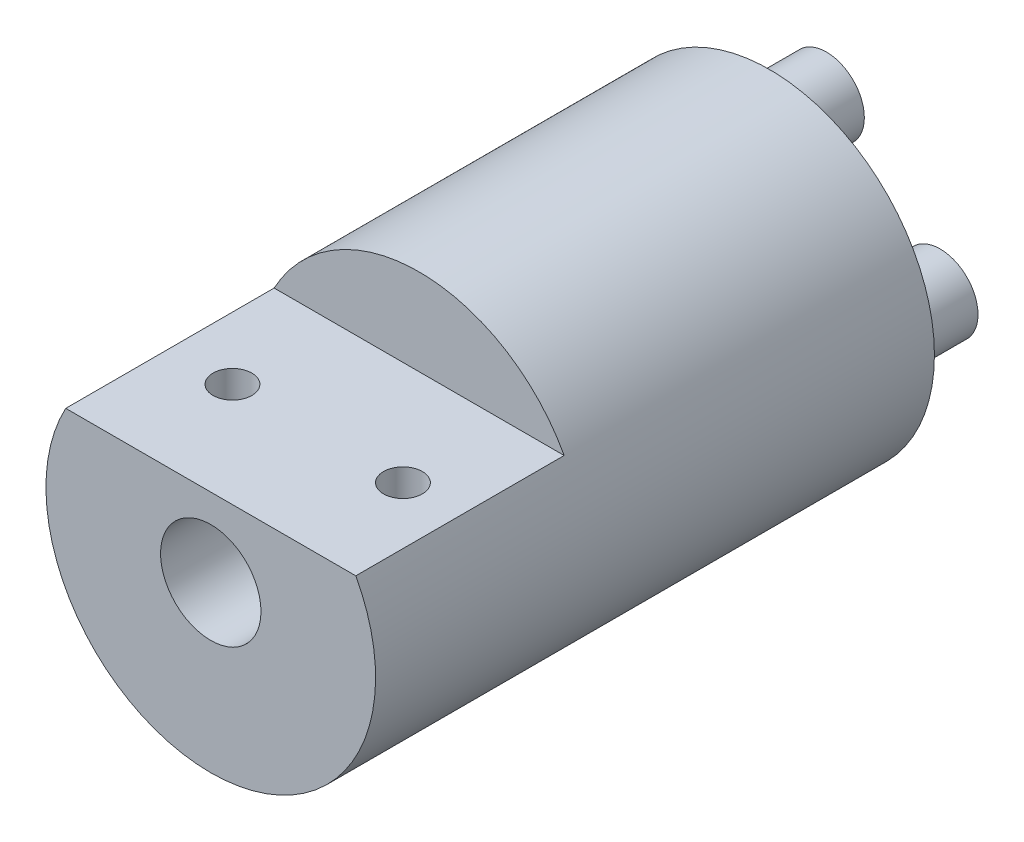
ISO-10303-21;
HEADER;
FILE_DESCRIPTION(('STEP AP214'),'2;1');
FILE_NAME('part.step','',(''),(''),'','','');
FILE_SCHEMA(('AUTOMOTIVE_DESIGN { 1 0 10303 214 1 1 1 1 }'));
ENDSEC;
DATA;
#1=APPLICATION_CONTEXT('core data for automotive mechanical design processes');
#2=APPLICATION_PROTOCOL_DEFINITION('international standard','automotive_design',2000,#1);
#3=PRODUCT_CONTEXT('',#1,'mechanical');
#4=PRODUCT('Part','Part','',(#3));
#5=PRODUCT_RELATED_PRODUCT_CATEGORY('part','',(#4));
#6=PRODUCT_DEFINITION_FORMATION('','',#4);
#7=PRODUCT_DEFINITION_CONTEXT('part definition',#1,'design');
#8=PRODUCT_DEFINITION('design','',#6,#7);
#9=PRODUCT_DEFINITION_SHAPE('','',#8);
#10=(LENGTH_UNIT() NAMED_UNIT(*) SI_UNIT(.MILLI.,.METRE.));
#11=(NAMED_UNIT(*) PLANE_ANGLE_UNIT() SI_UNIT($,.RADIAN.));
#12=(NAMED_UNIT(*) SI_UNIT($,.STERADIAN.) SOLID_ANGLE_UNIT());
#13=UNCERTAINTY_MEASURE_WITH_UNIT(LENGTH_MEASURE(1.E-05),#10,'distance_accuracy_value','');
#14=(GEOMETRIC_REPRESENTATION_CONTEXT(3) GLOBAL_UNCERTAINTY_ASSIGNED_CONTEXT((#13)) GLOBAL_UNIT_ASSIGNED_CONTEXT((#10,
#11,#12)) REPRESENTATION_CONTEXT('',''));
#15=CARTESIAN_POINT('',(0.,0.,0.));
#16=DIRECTION('',(0.,0.,1.));
#17=DIRECTION('',(1.,0.,0.));
#18=AXIS2_PLACEMENT_3D('',#15,#16,#17);
#19=CARTESIAN_POINT('',(0.,0.,29.5));
#20=DIRECTION('',(0.,0.,-1.));
#21=DIRECTION('',(-1.,0.,0.));
#22=AXIS2_PLACEMENT_3D('',#19,#20,#21);
#23=CYLINDRICAL_SURFACE('',#22,1.75);
#24=CARTESIAN_POINT('',(0.,0.,8.3));
#25=DIRECTION('',(0.,0.,1.));
#26=DIRECTION('',(1.,0.,0.));
#27=AXIS2_PLACEMENT_3D('',#24,#25,#26);
#28=CIRCLE('',#27,1.75);
#29=CARTESIAN_POINT('',(1.75,0.,8.3));
#30=VERTEX_POINT('',#29);
#31=EDGE_CURVE('E94',#30,#30,#28,.T.);
#32=ORIENTED_EDGE('',*,*,#31,.T.);
#33=EDGE_LOOP('',(#32));
#34=FACE_BOUND('',#33,.T.);
#35=CARTESIAN_POINT('',(0.,0.,0.));
#36=DIRECTION('',(0.,0.,-1.));
#37=DIRECTION('',(-1.,0.,0.));
#38=AXIS2_PLACEMENT_3D('',#35,#36,#37);
#39=CIRCLE('',#38,1.75);
#40=CARTESIAN_POINT('',(-1.75,0.,0.));
#41=VERTEX_POINT('',#40);
#42=EDGE_CURVE('E83',#41,#41,#39,.T.);
#43=ORIENTED_EDGE('',*,*,#42,.T.);
#44=EDGE_LOOP('',(#43));
#45=FACE_BOUND('',#44,.T.);
#46=ADVANCED_FACE('F33',(#34,#45),#23,.F.);
#47=CARTESIAN_POINT('',(0.,0.,29.5));
#48=DIRECTION('',(0.,0.,-1.));
#49=DIRECTION('',(-1.,0.,0.));
#50=AXIS2_PLACEMENT_3D('',#47,#48,#49);
#51=CYLINDRICAL_SURFACE('',#50,8.7);
#52=CARTESIAN_POINT('',(4.64445354346428,-7.35656518237976,25.025));
#53=CARTESIAN_POINT('',(4.71815393182572,-7.31003303115343,25.0249987797796));
#54=CARTESIAN_POINT('',(4.79120086093062,-7.26235113807829,25.0170490581823));
#55=CARTESIAN_POINT('',(4.93371045265028,-7.16630437975942,24.9860486364902));
#56=CARTESIAN_POINT('',(5.00316524240529,-7.11793828760546,24.9629661673902));
#57=CARTESIAN_POINT('',(5.13234537040392,-7.02530915044312,24.9040585753655));
#58=CARTESIAN_POINT('',(5.19240427455238,-6.98097384244621,24.8690792961992));
#59=CARTESIAN_POINT('',(5.30553479046785,-6.8953828658052,24.7864392723338));
#60=CARTESIAN_POINT('',(5.35862076745976,-6.8541209440096,24.7388052306372));
#61=CARTESIAN_POINT('',(5.44111107783713,-6.78868339315813,24.6469672172265));
#62=CARTESIAN_POINT('',(5.47287870889878,-6.76306095657114,24.6059063340448));
#63=CARTESIAN_POINT('',(5.53062049286008,-6.71592288239306,24.5177813027306));
#64=CARTESIAN_POINT('',(5.55660300930146,-6.6944013227447,24.4707259776544));
#65=CARTESIAN_POINT('',(5.59755819733306,-6.6601750756637,24.3798119717248));
#66=CARTESIAN_POINT('',(5.61365573407519,-6.64659069016058,24.3367945421334));
#67=CARTESIAN_POINT('',(5.64011710526801,-6.6241514473601,24.2478443046384));
#68=CARTESIAN_POINT('',(5.65048466506954,-6.61529351728231,24.2019134126338));
#69=CARTESIAN_POINT('',(5.66484680246569,-6.60299963344695,24.1080934713376));
#70=CARTESIAN_POINT('',(5.66880906823867,-6.59959117073903,24.0601957361293));
#71=CARTESIAN_POINT('',(5.66995213655247,-6.59860924979251,23.964260262807));
#72=CARTESIAN_POINT('',(5.6671339358747,-6.60103493388885,23.9162225463082));
#73=CARTESIAN_POINT('',(5.65544788493367,-6.61104825335389,23.825549208808));
#74=CARTESIAN_POINT('',(5.64709802675579,-6.61819376158997,23.782794761153));
#75=CARTESIAN_POINT('',(5.62537349968405,-6.63666895692325,23.6995450077957));
#76=CARTESIAN_POINT('',(5.61199797159353,-6.64799935947114,23.6590500897466));
#77=CARTESIAN_POINT('',(5.57970995690913,-6.67512622823768,23.5781533636793));
#78=CARTESIAN_POINT('',(5.56046348613067,-6.69118917236125,23.5379759391255));
#79=CARTESIAN_POINT('',(5.51769770025128,-6.72649858416267,23.4614893172049));
#80=CARTESIAN_POINT('',(5.49417498254176,-6.74574758588595,23.4251832370286));
#81=CARTESIAN_POINT('',(5.43142231018471,-6.79646631793209,23.3402478467985));
#82=CARTESIAN_POINT('',(5.39006378889856,-6.82937497625125,23.2940396390201));
#83=CARTESIAN_POINT('',(5.30131985403172,-6.89849142146871,23.2107815956532));
#84=CARTESIAN_POINT('',(5.25392507938524,-6.93470430731019,23.1737462538533));
#85=CARTESIAN_POINT('',(5.15383921261313,-7.00941427412087,23.1085054924574));
#86=CARTESIAN_POINT('',(5.10108760394258,-7.04793482185946,23.0804203365803));
#87=CARTESIAN_POINT('',(4.99198174042232,-7.12563040394744,23.0338906477511));
#88=CARTESIAN_POINT('',(4.93562791407123,-7.16480536004426,23.0154449705296));
#89=CARTESIAN_POINT('',(4.81169244339806,-7.24872478284551,22.9864469916565));
#90=CARTESIAN_POINT('',(4.74369588773675,-7.29342182496607,22.9774967927111));
#91=CARTESIAN_POINT('',(4.60610927787613,-7.38108475497537,22.973407937583));
#92=CARTESIAN_POINT('',(4.53651852060671,-7.42404985506514,22.9782754962882));
#93=CARTESIAN_POINT('',(4.3992385203194,-7.50619623345103,23.0023714705854));
#94=CARTESIAN_POINT('',(4.33153746812218,-7.54543120611925,23.0213430080897));
#95=CARTESIAN_POINT('',(4.19953977195899,-7.61968406373472,23.0738751274582));
#96=CARTESIAN_POINT('',(4.13523984654595,-7.65470605658775,23.1074213484731));
#97=CARTESIAN_POINT('',(4.0208662634321,-7.7153297110385,23.1839704994075));
#98=CARTESIAN_POINT('',(3.9700149693819,-7.74155991283555,23.2253094981075));
#99=CARTESIAN_POINT('',(3.87608187882106,-7.78901522999145,23.3183942939057));
#100=CARTESIAN_POINT('',(3.83299160455978,-7.8102458145767,23.3701286033301));
#101=CARTESIAN_POINT('',(3.76237881265611,-7.84447803418724,23.4746574568165));
#102=CARTESIAN_POINT('',(3.73352796025877,-7.85821133312875,23.5263179684659));
#103=CARTESIAN_POINT('',(3.68492834834605,-7.8811185766332,23.6346862651745));
#104=CARTESIAN_POINT('',(3.66517350201494,-7.8902955704824,23.6913906445996));
#105=CARTESIAN_POINT('',(3.63720273064806,-7.90322536669725,23.8024214713945));
#106=CARTESIAN_POINT('',(3.62807689304229,-7.9074068642865,23.8564706078811));
#107=CARTESIAN_POINT('',(3.61857630760304,-7.91175927682302,23.9654870774391));
#108=CARTESIAN_POINT('',(3.61819886176706,-7.91193142825204,24.0204541221945));
#109=CARTESIAN_POINT('',(3.62604964841011,-7.90833607113019,24.1274504989465));
#110=CARTESIAN_POINT('',(3.63394005588869,-7.90472321909037,24.179510353952));
#111=CARTESIAN_POINT('',(3.65746436780409,-7.89386600709286,24.2814485491898));
#112=CARTESIAN_POINT('',(3.67309800411338,-7.88662177288022,24.3313269648946));
#113=CARTESIAN_POINT('',(3.71161701593956,-7.86856734215734,24.427983748086));
#114=CARTESIAN_POINT('',(3.73456039829486,-7.8577285920322,24.4747335686749));
#115=CARTESIAN_POINT('',(3.78674726657341,-7.83271216068327,24.5635786597096));
#116=CARTESIAN_POINT('',(3.81599163147017,-7.81853401359505,24.6056732795238));
#117=CARTESIAN_POINT('',(3.88134641498917,-7.786304655176,24.6863850122854));
#118=CARTESIAN_POINT('',(3.91773086215512,-7.7680928421786,24.7247154355401));
#119=CARTESIAN_POINT('',(3.99499359395253,-7.72864202947403,24.794699375893));
#120=CARTESIAN_POINT('',(4.03587379790424,-7.70740173569705,24.8263500243103));
#121=CARTESIAN_POINT('',(4.12474776900221,-7.66023549888671,24.8852262756241));
#122=CARTESIAN_POINT('',(4.17305021149036,-7.63405874433185,24.9117832277125));
#123=CARTESIAN_POINT('',(4.271991043954,-7.57913546971955,24.9564754425296));
#124=CARTESIAN_POINT('',(4.32262929865055,-7.55038909839168,24.974611192302));
#125=CARTESIAN_POINT('',(4.41856092830397,-7.49459834866594,25.0008760721198));
#126=CARTESIAN_POINT('',(4.46373187065483,-7.46778987313824,25.0099721491783));
#127=CARTESIAN_POINT('',(4.55416765393656,-7.41298591876853,25.0220354547143));
#128=CARTESIAN_POINT('',(4.59943252003069,-7.38499006747672,25.0250007453905));
#129=CARTESIAN_POINT('',(4.64445354346428,-7.35656518237976,25.025));
#130=B_SPLINE_CURVE_WITH_KNOTS('',3,(#52,#53,#54,#55,#56,#57,#58,#59,#60,#61,#62,#63,#64,#65,
#66,#67,#68,#69,#70,#71,#72,#73,#74,#75,#76,#77,#78,#79,#80,#81,#82,#83,#84,#85,#86,#87,#88,#89,
#90,#91,#92,#93,#94,#95,#96,#97,#98,#99,#100,#101,#102,#103,#104,#105,#106,#107,#108,#109,#110,
#111,#112,#113,#114,#115,#116,#117,#118,#119,#120,#121,#122,#123,#124,#125,#126,#127,#128,#129),
.UNSPECIFIED.,.T.,.F.,(4,2,2,2,2,2,2,2,2,2,2,2,2,2,2,2,2,2,2,2,2,2,2,2,2,2,2,2,2,2,2,2,2,2,2,2,
2,2,4),(0.,0.261263380499854,0.523077009480396,0.76921241420961,1.0148325143346,
1.18789912579184,1.36071388635489,1.5038179571006,1.64682887879994,1.79055899999154,
1.93426799302658,2.06612728963617,2.19800913938953,2.33955757349703,2.48121913459888,
2.69069762179205,2.90050501825504,3.11302310372105,3.32551595616199,3.56993128448405,
3.81445656223008,4.05463412537287,4.29457556955478,4.50509593859626,4.71538493225158,
4.89661990149859,5.0777334160285,5.24182670869693,5.40586939434878,5.56346128494191,
5.7210477189264,5.87991721186796,6.03880888112733,6.20580093240574,6.37286455442908,
6.55519441095419,6.73751372104104,6.89706008126183,7.05665686273518),.UNSPECIFIED.);
#131=CARTESIAN_POINT('',(4.64445354346428,-7.35656518237976,25.025));
#132=VERTEX_POINT('',#131);
#133=EDGE_CURVE('E105',#132,#132,#130,.T.);
#134=ORIENTED_EDGE('',*,*,#133,.T.);
#135=EDGE_LOOP('',(#134));
#136=FACE_BOUND('',#135,.T.);
#137=CARTESIAN_POINT('',(-4.35554645653572,-7.53121604158048,25.025));
#138=CARTESIAN_POINT('',(-4.29400428038766,-7.56680795887507,25.0249993342608));
#139=CARTESIAN_POINT('',(-4.23201650551024,-7.60164240081337,25.0194560856518));
#140=CARTESIAN_POINT('',(-4.10882775341196,-7.6689278914294,24.9968315762793));
#141=CARTESIAN_POINT('',(-4.04762661929849,-7.70137942165169,24.9797526538265));
#142=CARTESIAN_POINT('',(-3.92772718640544,-7.76321665446499,24.9336704729739));
#143=CARTESIAN_POINT('',(-3.86904373645899,-7.79258534309199,24.9046050000717));
#144=CARTESIAN_POINT('',(-3.7569935006844,-7.84722143526912,24.83469203926));
#145=CARTESIAN_POINT('',(-3.70362372425557,-7.87249115086863,24.7938512296611));
#146=CARTESIAN_POINT('',(-3.60994323413651,-7.91585159217477,24.7059715796399));
#147=CARTESIAN_POINT('',(-3.56885512382942,-7.93441225926918,24.6599941045405));
#148=CARTESIAN_POINT('',(-3.49506956632667,-7.96719042664165,24.5603897927461));
#149=CARTESIAN_POINT('',(-3.46236609477792,-7.98141104664498,24.5067684914785));
#150=CARTESIAN_POINT('',(-3.40986146633821,-8.00397279938928,24.3993850881871));
#151=CARTESIAN_POINT('',(-3.38908617804231,-8.01276489614381,24.3461922839183));
#152=CARTESIAN_POINT('',(-3.35660164369548,-8.02642759664717,24.2366308713724));
#153=CARTESIAN_POINT('',(-3.34488872806173,-8.0312997876964,24.1802635584631));
#154=CARTESIAN_POINT('',(-3.33147312958303,-8.03687349496063,24.0694971388724));
#155=CARTESIAN_POINT('',(-3.32922754748633,-8.03780123206871,24.0151744006049));
#156=CARTESIAN_POINT('',(-3.33334630447946,-8.03609405425717,23.9069175977051));
#157=CARTESIAN_POINT('',(-3.33970930018121,-8.03345969521075,23.8529834737488));
#158=CARTESIAN_POINT('',(-3.36060616695197,-8.02473985388008,23.7479240845968));
#159=CARTESIAN_POINT('',(-3.37500763794755,-8.01871027964305,23.6967676799947));
#160=CARTESIAN_POINT('',(-3.41130942560675,-8.00333393197255,23.5977268776783));
#161=CARTESIAN_POINT('',(-3.43320999119779,-7.99398704842284,23.5498425886429));
#162=CARTESIAN_POINT('',(-3.48420000972969,-7.97189654934941,23.457583596));
#163=CARTESIAN_POINT('',(-3.51342881708616,-7.95908666071719,23.4133019963576));
#164=CARTESIAN_POINT('',(-3.57774771732605,-7.9303820327362,23.3303656722392));
#165=CARTESIAN_POINT('',(-3.61283891929251,-7.91448670957408,23.2917120150856));
#166=CARTESIAN_POINT('',(-3.68980769941173,-7.87890929137596,23.218728517958));
#167=CARTESIAN_POINT('',(-3.73195598439553,-7.85906448145331,23.1847642072846));
#168=CARTESIAN_POINT('',(-3.82006727091189,-7.81661555971276,23.1243610100446));
#169=CARTESIAN_POINT('',(-3.86603153392832,-7.79401053425238,23.0979246249525));
#170=CARTESIAN_POINT('',(-3.96470537082819,-7.74431566728342,23.0507257769388));
#171=CARTESIAN_POINT('',(-4.01764975983226,-7.71700530604508,23.0306877760172));
#172=CARTESIAN_POINT('',(-4.12498112225461,-7.66017136341189,22.9997054299539));
#173=CARTESIAN_POINT('',(-4.17936873151814,-7.63064679567203,22.9887651640561));
#174=CARTESIAN_POINT('',(-4.29436652076137,-7.56658511231489,22.9750132012102));
#175=CARTESIAN_POINT('',(-4.35499456004738,-7.53185610041308,22.9732434884127));
#176=CARTESIAN_POINT('',(-4.47494238072689,-7.46121608743635,22.9802042642983));
#177=CARTESIAN_POINT('',(-4.53426158579556,-7.42530458235648,22.9889392881853));
#178=CARTESIAN_POINT('',(-4.65599897262735,-7.3496456365721,23.0178391236633));
#179=CARTESIAN_POINT('',(-4.71815426172329,-7.30986600234234,23.0390366098801));
#180=CARTESIAN_POINT('',(-4.83786001754329,-7.23119967774362,23.0931818470149));
#181=CARTESIAN_POINT('',(-4.89540544158341,-7.19231399752878,23.1261422560299));
#182=CARTESIAN_POINT('',(-5.00511863645392,-7.11641146058272,23.2042005895051));
#183=CARTESIAN_POINT('',(-5.05717446419203,-7.07943930915505,23.2495011396175));
#184=CARTESIAN_POINT('',(-5.15246031512338,-7.01039240441176,23.3516163088381));
#185=CARTESIAN_POINT('',(-5.19571327596723,-6.97830497946207,23.408400214617));
#186=CARTESIAN_POINT('',(-5.25795574761008,-6.93144127943437,23.5115427852014));
#187=CARTESIAN_POINT('',(-5.28020770185791,-6.91447717479443,23.5549536908275));
#188=CARTESIAN_POINT('',(-5.31865564537531,-6.88494657213648,23.6457823977906));
#189=CARTESIAN_POINT('',(-5.33485728937619,-6.8723759685794,23.6931964066693));
#190=CARTESIAN_POINT('',(-5.36036024273163,-6.85250370417936,23.7912945387505));
#191=CARTESIAN_POINT('',(-5.36961398432916,-6.84523837420239,23.8419986680691));
#192=CARTESIAN_POINT('',(-5.3803541816674,-6.83680037833963,23.9447228569133));
#193=CARTESIAN_POINT('',(-5.38184460734218,-6.8356245984367,23.9967422301827));
#194=CARTESIAN_POINT('',(-5.37722204400399,-6.83926063199996,24.0945473199208));
#195=CARTESIAN_POINT('',(-5.37191421013725,-6.84343842036687,24.1403985737858));
#196=CARTESIAN_POINT('',(-5.35537655575865,-6.85638759426895,24.2303388244335));
#197=CARTESIAN_POINT('',(-5.3441460281097,-6.86515952831901,24.274427610111));
#198=CARTESIAN_POINT('',(-5.3161342998375,-6.88687389623165,24.3605283081061));
#199=CARTESIAN_POINT('',(-5.29926596350768,-6.89988171157331,24.4024948947835));
#200=CARTESIAN_POINT('',(-5.26076928127915,-6.92927790238886,24.482893300237));
#201=CARTESIAN_POINT('',(-5.23913910745361,-6.94566757590489,24.5213237535424));
#202=CARTESIAN_POINT('',(-5.18820738652277,-6.98381427326492,24.5998443715484));
#203=CARTESIAN_POINT('',(-5.15823826555677,-7.00600890058962,24.639286978872));
#204=CARTESIAN_POINT('',(-5.09388012285587,-7.05294086651045,24.7126525496323));
#205=CARTESIAN_POINT('',(-5.05948828812009,-7.07767982136524,24.7465719687401));
#206=CARTESIAN_POINT('',(-4.97975484263506,-7.13406444014185,24.8150328176498));
#207=CARTESIAN_POINT('',(-4.93360454744194,-7.16609597262649,24.8483165306307));
#208=CARTESIAN_POINT('',(-4.83718646398712,-7.23153032563,24.9065452719105));
#209=CARTESIAN_POINT('',(-4.78691550629087,-7.26493419164958,24.9314838050951));
#210=CARTESIAN_POINT('',(-4.67500389136191,-7.33753732122953,24.9760899094964));
#211=CARTESIAN_POINT('',(-4.61282501491254,-7.37681496953814,24.9942927602742));
#212=CARTESIAN_POINT('',(-4.48578050510063,-7.45475196019621,25.0187482180313));
#213=CARTESIAN_POINT('',(-4.4209148452415,-7.49341129644278,25.0250007071296));
#214=CARTESIAN_POINT('',(-4.35554645653572,-7.53121604158048,25.025));
#215=B_SPLINE_CURVE_WITH_KNOTS('',3,(#137,#138,#139,#140,#141,#142,#143,#144,#145,#146,#147,
#148,#149,#150,#151,#152,#153,#154,#155,#156,#157,#158,#159,#160,#161,#162,#163,#164,#165,#166,
#167,#168,#169,#170,#171,#172,#173,#174,#175,#176,#177,#178,#179,#180,#181,#182,#183,#184,#185,
#186,#187,#188,#189,#190,#191,#192,#193,#194,#195,#196,#197,#198,#199,#200,#201,#202,#203,#204,
#205,#206,#207,#208,#209,#210,#211,#212,#213,#214),.UNSPECIFIED.,.T.,.F.,(4,2,2,2,2,2,2,2,2,2,2,
2,2,2,2,2,2,2,2,2,2,2,2,2,2,2,2,2,2,2,2,2,2,2,2,2,2,2,4),(0.,0.213045968187148,0.42604876436599,
0.640171320999958,0.854172677399155,1.04628322642857,1.23825535496514,1.41069733148464,
1.58306944530965,1.74540993748608,1.90772509898274,2.06744249803457,2.22716519931253,
2.39019234578985,2.55325036972172,2.72548063306795,2.89776806065712,3.08555597727527,
3.27342804893546,3.48224139603765,3.69114492637777,3.92044463974753,4.14999185057976,
4.38356268477468,4.61651688281921,4.77086376557371,4.92506602969672,5.08031462383676,
5.23548382055918,5.37386553346146,5.51226377212171,5.65290838899227,5.79360708955357,
5.95585878903524,6.11821420146931,6.31335690448244,6.5086511371358,6.73494040996452,
6.96123191495047),.UNSPECIFIED.);
#216=CARTESIAN_POINT('',(-4.35554645653572,-7.53121604158048,25.025));
#217=VERTEX_POINT('',#216);
#218=EDGE_CURVE('E98',#217,#217,#215,.T.);
#219=ORIENTED_EDGE('',*,*,#218,.T.);
#220=EDGE_LOOP('',(#219));
#221=FACE_BOUND('',#220,.T.);
#222=CARTESIAN_POINT('',(0.,0.,29.5));
#223=DIRECTION('',(0.,0.,1.));
#224=DIRECTION('',(1.,0.,0.));
#225=AXIS2_PLACEMENT_3D('',#222,#223,#224);
#226=CIRCLE('',#225,8.7);
#227=CARTESIAN_POINT('',(-7.65554645653572,4.1331112314845,29.5));
#228=VERTEX_POINT('',#227);
#229=CARTESIAN_POINT('',(7.65554645653572,4.1331112314845,29.5));
#230=VERTEX_POINT('',#229);
#231=EDGE_CURVE('E65',#228,#230,#226,.T.);
#232=ORIENTED_EDGE('',*,*,#231,.F.);
#233=DIRECTION('',(0.,0.,1.));
#234=VECTOR('',#233,1.);
#235=CARTESIAN_POINT('',(-7.65554645653572,4.1331112314845,18.5));
#236=LINE('',#235,#234);
#237=CARTESIAN_POINT('',(-7.65554645653572,4.1331112314845,18.5));
#238=VERTEX_POINT('',#237);
#239=EDGE_CURVE('E48',#238,#228,#236,.T.);
#240=ORIENTED_EDGE('',*,*,#239,.F.);
#241=CARTESIAN_POINT('',(0.,0.,18.5));
#242=DIRECTION('',(0.,0.,1.));
#243=DIRECTION('',(1.,0.,0.));
#244=AXIS2_PLACEMENT_3D('',#241,#242,#243);
#245=CIRCLE('',#244,8.7);
#246=CARTESIAN_POINT('',(7.65554645653572,4.1331112314845,18.5));
#247=VERTEX_POINT('',#246);
#248=EDGE_CURVE('E55',#247,#238,#245,.T.);
#249=ORIENTED_EDGE('',*,*,#248,.F.);
#250=DIRECTION('',(0.,0.,-1.));
#251=VECTOR('',#250,1.);
#252=CARTESIAN_POINT('',(7.65554645653572,4.1331112314845,29.5));
#253=LINE('',#252,#251);
#254=EDGE_CURVE('E68',#247,#230,#253,.F.);
#255=ORIENTED_EDGE('',*,*,#254,.T.);
#256=EDGE_LOOP('',(#232,#240,#249,#255));
#257=FACE_BOUND('',#256,.T.);
#258=CARTESIAN_POINT('',(0.,0.,0.));
#259=DIRECTION('',(0.,0.,1.));
#260=DIRECTION('',(1.,0.,0.));
#261=AXIS2_PLACEMENT_3D('',#258,#259,#260);
#262=CIRCLE('',#261,8.7);
#263=CARTESIAN_POINT('',(8.7,0.,0.));
#264=VERTEX_POINT('',#263);
#265=EDGE_CURVE('E88',#264,#264,#262,.T.);
#266=ORIENTED_EDGE('',*,*,#265,.T.);
#267=EDGE_LOOP('',(#266));
#268=FACE_BOUND('',#267,.T.);
#269=ADVANCED_FACE('F72',(#136,#221,#257,#268),#51,.T.);
#270=CARTESIAN_POINT('',(0.,0.,29.5));
#271=DIRECTION('',(0.,0.,1.));
#272=DIRECTION('',(1.,0.,0.));
#273=AXIS2_PLACEMENT_3D('',#270,#271,#272);
#274=PLANE('',#273);
#275=DIRECTION('',(1.,0.,0.));
#276=VECTOR('',#275,1.);
#277=CARTESIAN_POINT('',(-7.65554645653572,4.1331112314845,29.5));
#278=LINE('',#277,#276);
#279=EDGE_CURVE('E69',#228,#230,#278,.T.);
#280=ORIENTED_EDGE('',*,*,#279,.F.);
#281=ORIENTED_EDGE('',*,*,#231,.T.);
#282=EDGE_LOOP('',(#280,#281));
#283=FACE_BOUND('',#282,.T.);
#284=CARTESIAN_POINT('',(0.,0.,29.5));
#285=DIRECTION('',(0.,0.,1.));
#286=DIRECTION('',(1.,0.,0.));
#287=AXIS2_PLACEMENT_3D('',#284,#285,#286);
#288=CIRCLE('',#287,2.65);
#289=CARTESIAN_POINT('',(2.65,0.,29.5));
#290=VERTEX_POINT('',#289);
#291=EDGE_CURVE('E76',#290,#290,#288,.T.);
#292=ORIENTED_EDGE('',*,*,#291,.F.);
#293=EDGE_LOOP('',(#292));
#294=FACE_BOUND('',#293,.T.);
#295=ADVANCED_FACE('F137',(#283,#294),#274,.T.);
#296=CARTESIAN_POINT('',(0.,0.,0.));
#297=DIRECTION('',(0.,0.,1.));
#298=DIRECTION('',(1.,0.,0.));
#299=AXIS2_PLACEMENT_3D('',#296,#297,#298);
#300=PLANE('',#299);
#301=CARTESIAN_POINT('',(6.,0.,0.));
#302=DIRECTION('',(0.,0.,1.));
#303=DIRECTION('',(1.,0.,0.));
#304=AXIS2_PLACEMENT_3D('',#301,#302,#303);
#305=CIRCLE('',#304,2.);
#306=CARTESIAN_POINT('',(8.,0.,0.));
#307=VERTEX_POINT('',#306);
#308=EDGE_CURVE('E11',#307,#307,#305,.F.);
#309=ORIENTED_EDGE('',*,*,#308,.F.);
#310=EDGE_LOOP('',(#309));
#311=FACE_BOUND('',#310,.T.);
#312=CARTESIAN_POINT('',(0.,-6.,0.));
#313=DIRECTION('',(0.,0.,1.));
#314=DIRECTION('',(1.,0.,0.));
#315=AXIS2_PLACEMENT_3D('',#312,#313,#314);
#316=CIRCLE('',#315,2.);
#317=CARTESIAN_POINT('',(2.,-6.,0.));
#318=VERTEX_POINT('',#317);
#319=EDGE_CURVE('E41',#318,#318,#316,.F.);
#320=ORIENTED_EDGE('',*,*,#319,.F.);
#321=EDGE_LOOP('',(#320));
#322=FACE_BOUND('',#321,.T.);
#323=CARTESIAN_POINT('',(-6.,0.,0.));
#324=DIRECTION('',(0.,0.,1.));
#325=DIRECTION('',(1.,0.,0.));
#326=AXIS2_PLACEMENT_3D('',#323,#324,#325);
#327=CIRCLE('',#326,2.);
#328=CARTESIAN_POINT('',(-4.,0.,0.));
#329=VERTEX_POINT('',#328);
#330=EDGE_CURVE('E152',#329,#329,#327,.F.);
#331=ORIENTED_EDGE('',*,*,#330,.F.);
#332=EDGE_LOOP('',(#331));
#333=FACE_BOUND('',#332,.T.);
#334=CARTESIAN_POINT('',(0.,6.,0.));
#335=DIRECTION('',(0.,0.,1.));
#336=DIRECTION('',(1.,0.,0.));
#337=AXIS2_PLACEMENT_3D('',#334,#335,#336);
#338=CIRCLE('',#337,2.);
#339=CARTESIAN_POINT('',(2.,6.,0.));
#340=VERTEX_POINT('',#339);
#341=EDGE_CURVE('E97',#340,#340,#338,.F.);
#342=ORIENTED_EDGE('',*,*,#341,.F.);
#343=EDGE_LOOP('',(#342));
#344=FACE_BOUND('',#343,.T.);
#345=ORIENTED_EDGE('',*,*,#42,.F.);
#346=EDGE_LOOP('',(#345));
#347=FACE_BOUND('',#346,.T.);
#348=ORIENTED_EDGE('',*,*,#265,.F.);
#349=EDGE_LOOP('',(#348));
#350=FACE_BOUND('',#349,.T.);
#351=ADVANCED_FACE('F129',(#311,#322,#333,#344,#347,#350),#300,.F.);
#352=CARTESIAN_POINT('',(0.,0.,8.6));
#353=DIRECTION('',(0.,0.,1.));
#354=DIRECTION('',(1.,0.,0.));
#355=AXIS2_PLACEMENT_3D('',#352,#353,#354);
#356=PLANE('',#355);
#357=CARTESIAN_POINT('',(0.,0.,8.6));
#358=DIRECTION('',(0.,0.,1.));
#359=DIRECTION('',(1.,0.,0.));
#360=AXIS2_PLACEMENT_3D('',#357,#358,#359);
#361=CIRCLE('',#360,2.05);
#362=CARTESIAN_POINT('',(2.05,0.,8.6));
#363=VERTEX_POINT('',#362);
#364=EDGE_CURVE('E64',#363,#363,#361,.F.);
#365=ORIENTED_EDGE('',*,*,#364,.T.);
#366=EDGE_LOOP('',(#365));
#367=FACE_BOUND('',#366,.T.);
#368=CARTESIAN_POINT('',(0.,0.,8.6));
#369=DIRECTION('',(0.,0.,1.));
#370=DIRECTION('',(1.,0.,0.));
#371=AXIS2_PLACEMENT_3D('',#368,#369,#370);
#372=CIRCLE('',#371,2.65);
#373=CARTESIAN_POINT('',(2.65,0.,8.6));
#374=VERTEX_POINT('',#373);
#375=EDGE_CURVE('E80',#374,#374,#372,.T.);
#376=ORIENTED_EDGE('',*,*,#375,.T.);
#377=EDGE_LOOP('',(#376));
#378=FACE_BOUND('',#377,.T.);
#379=ADVANCED_FACE('F126',(#367,#378),#356,.T.);
#380=CARTESIAN_POINT('',(0.,0.,8.6));
#381=DIRECTION('',(0.,0.,1.));
#382=DIRECTION('',(1.,0.,0.));
#383=AXIS2_PLACEMENT_3D('',#380,#381,#382);
#384=CYLINDRICAL_SURFACE('',#383,2.65);
#385=ORIENTED_EDGE('',*,*,#375,.F.);
#386=EDGE_LOOP('',(#385));
#387=FACE_BOUND('',#386,.T.);
#388=ORIENTED_EDGE('',*,*,#291,.T.);
#389=EDGE_LOOP('',(#388));
#390=FACE_BOUND('',#389,.T.);
#391=ADVANCED_FACE('F122',(#387,#390),#384,.F.);
#392=CARTESIAN_POINT('',(0.,0.,18.5));
#393=DIRECTION('',(0.,0.,1.));
#394=DIRECTION('',(1.,0.,0.));
#395=AXIS2_PLACEMENT_3D('',#392,#393,#394);
#396=PLANE('',#395);
#397=DIRECTION('',(1.,0.,0.));
#398=VECTOR('',#397,1.);
#399=CARTESIAN_POINT('',(-7.65554645653572,4.1331112314845,18.5));
#400=LINE('',#399,#398);
#401=EDGE_CURVE('E63',#238,#247,#400,.T.);
#402=ORIENTED_EDGE('',*,*,#401,.T.);
#403=ORIENTED_EDGE('',*,*,#248,.T.);
#404=EDGE_LOOP('',(#402,#403));
#405=FACE_BOUND('',#404,.T.);
#406=ADVANCED_FACE('F62',(#405),#396,.T.);
#407=CARTESIAN_POINT('',(-7.65554645653572,4.1331112314845,18.5));
#408=DIRECTION('',(0.,-1.,0.));
#409=DIRECTION('',(0.,0.,-1.));
#410=AXIS2_PLACEMENT_3D('',#407,#408,#409);
#411=PLANE('',#410);
#412=CARTESIAN_POINT('',(4.64445354346428,4.1331112314845,24.));
#413=DIRECTION('',(0.,1.,0.));
#414=DIRECTION('',(0.,0.,1.));
#415=AXIS2_PLACEMENT_3D('',#412,#413,#414);
#416=CIRCLE('',#415,1.02499999999999);
#417=CARTESIAN_POINT('',(4.64445354346428,4.1331112314845,25.025));
#418=VERTEX_POINT('',#417);
#419=EDGE_CURVE('E169',#418,#418,#416,.T.);
#420=ORIENTED_EDGE('',*,*,#419,.F.);
#421=EDGE_LOOP('',(#420));
#422=FACE_BOUND('',#421,.T.);
#423=CARTESIAN_POINT('',(-4.35554645653572,4.1331112314845,24.));
#424=DIRECTION('',(0.,1.,0.));
#425=DIRECTION('',(0.,0.,1.));
#426=AXIS2_PLACEMENT_3D('',#423,#424,#425);
#427=CIRCLE('',#426,1.02499999999999);
#428=CARTESIAN_POINT('',(-4.35554645653572,4.1331112314845,25.025));
#429=VERTEX_POINT('',#428);
#430=EDGE_CURVE('E104',#429,#429,#427,.T.);
#431=ORIENTED_EDGE('',*,*,#430,.F.);
#432=EDGE_LOOP('',(#431));
#433=FACE_BOUND('',#432,.T.);
#434=ORIENTED_EDGE('',*,*,#401,.F.);
#435=ORIENTED_EDGE('',*,*,#239,.T.);
#436=ORIENTED_EDGE('',*,*,#279,.T.);
#437=ORIENTED_EDGE('',*,*,#254,.F.);
#438=EDGE_LOOP('',(#434,#435,#436,#437));
#439=FACE_BOUND('',#438,.T.);
#440=ADVANCED_FACE('F67',(#422,#433,#439),#411,.F.);
#441=CARTESIAN_POINT('',(0.,0.,8.3));
#442=DIRECTION('',(0.,0.,1.));
#443=DIRECTION('',(1.,0.,0.));
#444=AXIS2_PLACEMENT_3D('',#441,#442,#443);
#445=TOROIDAL_SURFACE('',#444,2.05,0.3);
#446=ORIENTED_EDGE('',*,*,#31,.F.);
#447=EDGE_LOOP('',(#446));
#448=FACE_BOUND('',#447,.T.);
#449=ORIENTED_EDGE('',*,*,#364,.F.);
#450=EDGE_LOOP('',(#449));
#451=FACE_BOUND('',#450,.T.);
#452=ADVANCED_FACE('F35',(#448,#451),#445,.T.);
#453=CARTESIAN_POINT('',(-4.35554645653572,4.1331112314845,24.));
#454=DIRECTION('',(0.,1.,0.));
#455=DIRECTION('',(0.,0.,1.));
#456=AXIS2_PLACEMENT_3D('',#453,#454,#455);
#457=CYLINDRICAL_SURFACE('',#456,1.02499999999999);
#458=ORIENTED_EDGE('',*,*,#430,.T.);
#459=EDGE_LOOP('',(#458));
#460=FACE_BOUND('',#459,.T.);
#461=ORIENTED_EDGE('',*,*,#218,.F.);
#462=EDGE_LOOP('',(#461));
#463=FACE_BOUND('',#462,.T.);
#464=ADVANCED_FACE('F112',(#460,#463),#457,.F.);
#465=CARTESIAN_POINT('',(4.64445354346428,4.1331112314845,24.));
#466=DIRECTION('',(0.,1.,0.));
#467=DIRECTION('',(0.,0.,1.));
#468=AXIS2_PLACEMENT_3D('',#465,#466,#467);
#469=CYLINDRICAL_SURFACE('',#468,1.02499999999999);
#470=ORIENTED_EDGE('',*,*,#419,.T.);
#471=EDGE_LOOP('',(#470));
#472=FACE_BOUND('',#471,.T.);
#473=ORIENTED_EDGE('',*,*,#133,.F.);
#474=EDGE_LOOP('',(#473));
#475=FACE_BOUND('',#474,.T.);
#476=ADVANCED_FACE('F116',(#472,#475),#469,.F.);
#477=CARTESIAN_POINT('',(0.,6.,-3.));
#478=DIRECTION('',(0.,0.,1.));
#479=DIRECTION('',(1.,0.,0.));
#480=AXIS2_PLACEMENT_3D('',#477,#478,#479);
#481=CYLINDRICAL_SURFACE('',#480,2.);
#482=CARTESIAN_POINT('',(0.,6.,-3.));
#483=DIRECTION('',(0.,0.,-1.));
#484=DIRECTION('',(-1.,0.,0.));
#485=AXIS2_PLACEMENT_3D('',#482,#483,#484);
#486=CIRCLE('',#485,2.);
#487=CARTESIAN_POINT('',(-2.,6.,-3.));
#488=VERTEX_POINT('',#487);
#489=EDGE_CURVE('E173',#488,#488,#486,.T.);
#490=ORIENTED_EDGE('',*,*,#489,.F.);
#491=EDGE_LOOP('',(#490));
#492=FACE_BOUND('',#491,.T.);
#493=ORIENTED_EDGE('',*,*,#341,.T.);
#494=EDGE_LOOP('',(#493));
#495=FACE_BOUND('',#494,.T.);
#496=ADVANCED_FACE('F219',(#492,#495),#481,.T.);
#497=CARTESIAN_POINT('',(0.,6.,-3.));
#498=DIRECTION('',(0.,0.,-1.));
#499=DIRECTION('',(-1.,0.,0.));
#500=AXIS2_PLACEMENT_3D('',#497,#498,#499);
#501=PLANE('',#500);
#502=ORIENTED_EDGE('',*,*,#489,.T.);
#503=EDGE_LOOP('',(#502));
#504=FACE_BOUND('',#503,.T.);
#505=ADVANCED_FACE('F216',(#504),#501,.T.);
#506=CARTESIAN_POINT('',(-6.,0.,-3.));
#507=DIRECTION('',(0.,0.,1.));
#508=DIRECTION('',(1.,0.,0.));
#509=AXIS2_PLACEMENT_3D('',#506,#507,#508);
#510=CYLINDRICAL_SURFACE('',#509,2.);
#511=CARTESIAN_POINT('',(-6.,0.,-3.));
#512=DIRECTION('',(0.,0.,-1.));
#513=DIRECTION('',(-1.,0.,0.));
#514=AXIS2_PLACEMENT_3D('',#511,#512,#513);
#515=CIRCLE('',#514,2.);
#516=CARTESIAN_POINT('',(-8.,0.,-3.));
#517=VERTEX_POINT('',#516);
#518=EDGE_CURVE('E178',#517,#517,#515,.T.);
#519=ORIENTED_EDGE('',*,*,#518,.F.);
#520=EDGE_LOOP('',(#519));
#521=FACE_BOUND('',#520,.T.);
#522=ORIENTED_EDGE('',*,*,#330,.T.);
#523=EDGE_LOOP('',(#522));
#524=FACE_BOUND('',#523,.T.);
#525=ADVANCED_FACE('F212',(#521,#524),#510,.T.);
#526=CARTESIAN_POINT('',(-6.,0.,-3.));
#527=DIRECTION('',(0.,0.,-1.));
#528=DIRECTION('',(-1.,0.,0.));
#529=AXIS2_PLACEMENT_3D('',#526,#527,#528);
#530=PLANE('',#529);
#531=ORIENTED_EDGE('',*,*,#518,.T.);
#532=EDGE_LOOP('',(#531));
#533=FACE_BOUND('',#532,.T.);
#534=ADVANCED_FACE('F208',(#533),#530,.T.);
#535=CARTESIAN_POINT('',(0.,-6.,-3.));
#536=DIRECTION('',(0.,0.,1.));
#537=DIRECTION('',(1.,0.,0.));
#538=AXIS2_PLACEMENT_3D('',#535,#536,#537);
#539=CYLINDRICAL_SURFACE('',#538,2.);
#540=CARTESIAN_POINT('',(0.,-6.,-3.));
#541=DIRECTION('',(0.,0.,-1.));
#542=DIRECTION('',(-1.,0.,0.));
#543=AXIS2_PLACEMENT_3D('',#540,#541,#542);
#544=CIRCLE('',#543,2.);
#545=CARTESIAN_POINT('',(-2.,-6.,-3.));
#546=VERTEX_POINT('',#545);
#547=EDGE_CURVE('E183',#546,#546,#544,.T.);
#548=ORIENTED_EDGE('',*,*,#547,.F.);
#549=EDGE_LOOP('',(#548));
#550=FACE_BOUND('',#549,.T.);
#551=ORIENTED_EDGE('',*,*,#319,.T.);
#552=EDGE_LOOP('',(#551));
#553=FACE_BOUND('',#552,.T.);
#554=ADVANCED_FACE('F202',(#550,#553),#539,.T.);
#555=CARTESIAN_POINT('',(0.,-6.,-3.));
#556=DIRECTION('',(0.,0.,-1.));
#557=DIRECTION('',(-1.,0.,0.));
#558=AXIS2_PLACEMENT_3D('',#555,#556,#557);
#559=PLANE('',#558);
#560=ORIENTED_EDGE('',*,*,#547,.T.);
#561=EDGE_LOOP('',(#560));
#562=FACE_BOUND('',#561,.T.);
#563=ADVANCED_FACE('F195',(#562),#559,.T.);
#564=CARTESIAN_POINT('',(6.,0.,-3.));
#565=DIRECTION('',(0.,0.,1.));
#566=DIRECTION('',(1.,0.,0.));
#567=AXIS2_PLACEMENT_3D('',#564,#565,#566);
#568=CYLINDRICAL_SURFACE('',#567,2.);
#569=CARTESIAN_POINT('',(6.,0.,-3.));
#570=DIRECTION('',(0.,0.,-1.));
#571=DIRECTION('',(-1.,0.,0.));
#572=AXIS2_PLACEMENT_3D('',#569,#570,#571);
#573=CIRCLE('',#572,2.);
#574=CARTESIAN_POINT('',(4.,0.,-3.));
#575=VERTEX_POINT('',#574);
#576=EDGE_CURVE('E186',#575,#575,#573,.T.);
#577=ORIENTED_EDGE('',*,*,#576,.F.);
#578=EDGE_LOOP('',(#577));
#579=FACE_BOUND('',#578,.T.);
#580=ORIENTED_EDGE('',*,*,#308,.T.);
#581=EDGE_LOOP('',(#580));
#582=FACE_BOUND('',#581,.T.);
#583=ADVANCED_FACE('F192',(#579,#582),#568,.T.);
#584=CARTESIAN_POINT('',(6.,0.,-3.));
#585=DIRECTION('',(0.,0.,-1.));
#586=DIRECTION('',(-1.,0.,0.));
#587=AXIS2_PLACEMENT_3D('',#584,#585,#586);
#588=PLANE('',#587);
#589=ORIENTED_EDGE('',*,*,#576,.T.);
#590=EDGE_LOOP('',(#589));
#591=FACE_BOUND('',#590,.T.);
#592=ADVANCED_FACE('F190',(#591),#588,.T.);
#593=CLOSED_SHELL('',(#46,#269,#295,#351,#379,#391,#406,#440,#452,#464,#476,#496,#505,#525,#534,
#554,#563,#583,#592));
#594=MANIFOLD_SOLID_BREP('B2',#593);
#595=ADVANCED_BREP_SHAPE_REPRESENTATION('',(#18,#594),#14);
#596=SHAPE_DEFINITION_REPRESENTATION(#9,#595);
ENDSEC;
END-ISO-10303-21;
